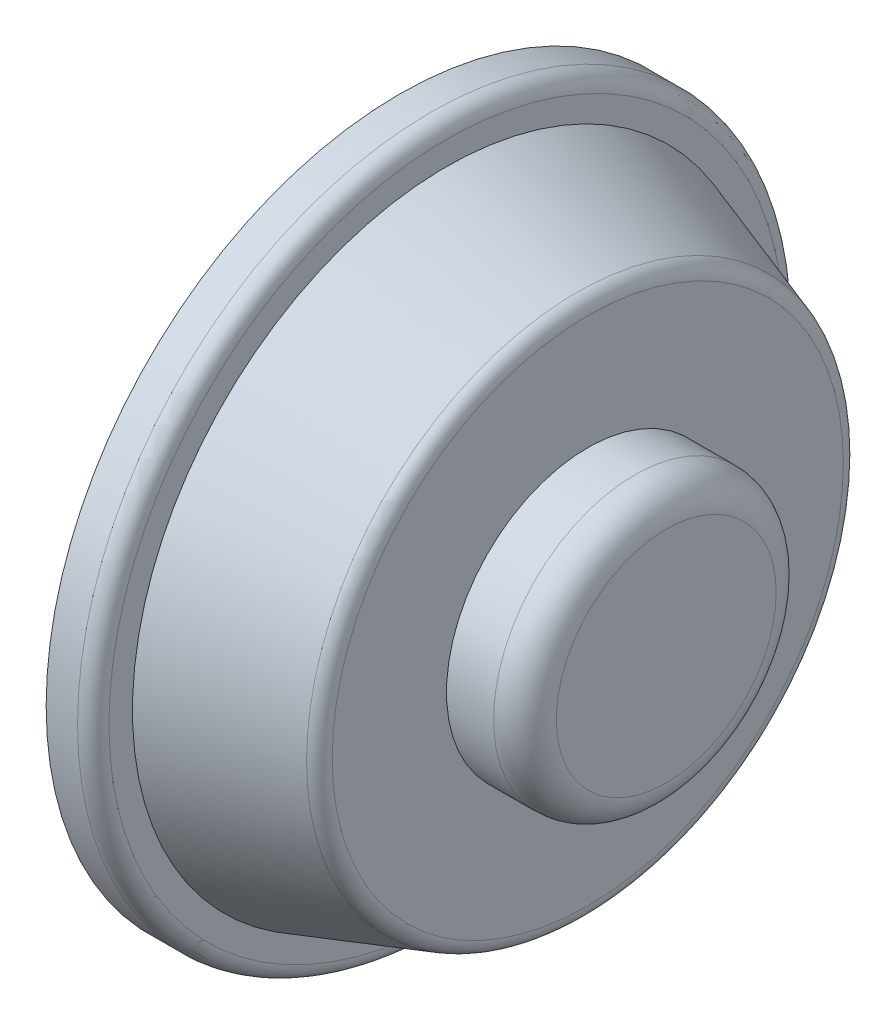
ISO-10303-21;
HEADER;
FILE_DESCRIPTION(('STEP AP214'),'2;1');
FILE_NAME('part.step','',(''),(''),'','','');
FILE_SCHEMA(('AUTOMOTIVE_DESIGN { 1 0 10303 214 1 1 1 1 }'));
ENDSEC;
DATA;
#1=APPLICATION_CONTEXT('core data for automotive mechanical design processes');
#2=APPLICATION_PROTOCOL_DEFINITION('international standard','automotive_design',2000,#1);
#3=PRODUCT_CONTEXT('',#1,'mechanical');
#4=PRODUCT('Part','Part','',(#3));
#5=PRODUCT_RELATED_PRODUCT_CATEGORY('part','',(#4));
#6=PRODUCT_DEFINITION_FORMATION('','',#4);
#7=PRODUCT_DEFINITION_CONTEXT('part definition',#1,'design');
#8=PRODUCT_DEFINITION('design','',#6,#7);
#9=PRODUCT_DEFINITION_SHAPE('','',#8);
#10=(LENGTH_UNIT() NAMED_UNIT(*) SI_UNIT(.MILLI.,.METRE.));
#11=(NAMED_UNIT(*) PLANE_ANGLE_UNIT() SI_UNIT($,.RADIAN.));
#12=(NAMED_UNIT(*) SI_UNIT($,.STERADIAN.) SOLID_ANGLE_UNIT());
#13=UNCERTAINTY_MEASURE_WITH_UNIT(LENGTH_MEASURE(1.E-05),#10,'distance_accuracy_value','');
#14=(GEOMETRIC_REPRESENTATION_CONTEXT(3) GLOBAL_UNCERTAINTY_ASSIGNED_CONTEXT((#13)) GLOBAL_UNIT_ASSIGNED_CONTEXT((#10,
#11,#12)) REPRESENTATION_CONTEXT('',''));
#15=CARTESIAN_POINT('',(0.,0.,0.));
#16=DIRECTION('',(0.,0.,1.));
#17=DIRECTION('',(1.,0.,0.));
#18=AXIS2_PLACEMENT_3D('',#15,#16,#17);
#19=CARTESIAN_POINT('',(3.,0.,0.));
#20=DIRECTION('',(1.,0.,0.));
#21=DIRECTION('',(0.,0.,-1.));
#22=AXIS2_PLACEMENT_3D('',#19,#20,#21);
#23=PLANE('',#22);
#24=CARTESIAN_POINT('',(3.,0.,0.));
#25=DIRECTION('',(1.,0.,0.));
#26=DIRECTION('',(0.,0.,-1.));
#27=AXIS2_PLACEMENT_3D('',#24,#25,#26);
#28=CIRCLE('',#27,21.5);
#29=CARTESIAN_POINT('',(3.,0.,-21.5));
#30=VERTEX_POINT('',#29);
#31=EDGE_CURVE('E70',#30,#30,#28,.T.);
#32=ORIENTED_EDGE('',*,*,#31,.T.);
#33=EDGE_LOOP('',(#32));
#34=FACE_BOUND('',#33,.T.);
#35=CARTESIAN_POINT('',(3.,0.,0.));
#36=DIRECTION('',(1.,0.,0.));
#37=DIRECTION('',(0.,0.,-1.));
#38=AXIS2_PLACEMENT_3D('',#35,#36,#37);
#39=CIRCLE('',#38,20.);
#40=CARTESIAN_POINT('',(3.,0.,-20.));
#41=VERTEX_POINT('',#40);
#42=EDGE_CURVE('E83',#41,#41,#39,.T.);
#43=ORIENTED_EDGE('',*,*,#42,.F.);
#44=EDGE_LOOP('',(#43));
#45=FACE_BOUND('',#44,.T.);
#46=ADVANCED_FACE('F47',(#34,#45),#23,.T.);
#47=CARTESIAN_POINT('',(3.,0.,0.));
#48=DIRECTION('',(-1.,0.,0.));
#49=DIRECTION('',(0.,0.,1.));
#50=AXIS2_PLACEMENT_3D('',#47,#48,#49);
#51=CYLINDRICAL_SURFACE('',#50,22.5);
#52=CARTESIAN_POINT('',(2.,0.,0.));
#53=DIRECTION('',(1.,0.,0.));
#54=DIRECTION('',(0.,0.,-1.));
#55=AXIS2_PLACEMENT_3D('',#52,#53,#54);
#56=CIRCLE('',#55,22.5);
#57=CARTESIAN_POINT('',(2.,0.,-22.5));
#58=VERTEX_POINT('',#57);
#59=EDGE_CURVE('E67',#58,#58,#56,.F.);
#60=ORIENTED_EDGE('',*,*,#59,.T.);
#61=EDGE_LOOP('',(#60));
#62=FACE_BOUND('',#61,.T.);
#63=CARTESIAN_POINT('',(0.,0.,0.));
#64=DIRECTION('',(1.,0.,0.));
#65=DIRECTION('',(0.,0.,-1.));
#66=AXIS2_PLACEMENT_3D('',#63,#64,#65);
#67=CIRCLE('',#66,22.5);
#68=CARTESIAN_POINT('',(0.,0.,-22.5));
#69=VERTEX_POINT('',#68);
#70=EDGE_CURVE('E80',#69,#69,#67,.T.);
#71=ORIENTED_EDGE('',*,*,#70,.T.);
#72=EDGE_LOOP('',(#71));
#73=FACE_BOUND('',#72,.T.);
#74=ADVANCED_FACE('F108',(#62,#73),#51,.T.);
#75=CARTESIAN_POINT('',(0.,0.,0.));
#76=DIRECTION('',(1.,0.,0.));
#77=DIRECTION('',(0.,0.,-1.));
#78=AXIS2_PLACEMENT_3D('',#75,#76,#77);
#79=PLANE('',#78);
#80=CARTESIAN_POINT('',(0.,0.,0.));
#81=DIRECTION('',(-1.,0.,0.));
#82=DIRECTION('',(0.,0.,1.));
#83=AXIS2_PLACEMENT_3D('',#80,#81,#82);
#84=CIRCLE('',#83,21.);
#85=CARTESIAN_POINT('',(0.,0.,21.));
#86=VERTEX_POINT('',#85);
#87=EDGE_CURVE('E86',#86,#86,#84,.T.);
#88=ORIENTED_EDGE('',*,*,#87,.F.);
#89=EDGE_LOOP('',(#88));
#90=FACE_BOUND('',#89,.T.);
#91=ORIENTED_EDGE('',*,*,#70,.F.);
#92=EDGE_LOOP('',(#91));
#93=FACE_BOUND('',#92,.T.);
#94=ADVANCED_FACE('F104',(#90,#93),#79,.F.);
#95=CARTESIAN_POINT('',(12.,0.,0.));
#96=DIRECTION('',(1.,0.,0.));
#97=DIRECTION('',(0.,0.,-1.));
#98=AXIS2_PLACEMENT_3D('',#95,#96,#97);
#99=PLANE('',#98);
#100=CARTESIAN_POINT('',(12.,0.,0.));
#101=DIRECTION('',(1.,0.,0.));
#102=DIRECTION('',(0.,0.,-1.));
#103=AXIS2_PLACEMENT_3D('',#100,#101,#102);
#104=CIRCLE('',#103,16.2792407799439);
#105=CARTESIAN_POINT('',(12.,0.,-16.2792407799439));
#106=VERTEX_POINT('',#105);
#107=EDGE_CURVE('E62',#106,#106,#104,.T.);
#108=ORIENTED_EDGE('',*,*,#107,.T.);
#109=EDGE_LOOP('',(#108));
#110=FACE_BOUND('',#109,.T.);
#111=CARTESIAN_POINT('',(12.,0.,0.));
#112=DIRECTION('',(1.,0.,0.));
#113=DIRECTION('',(0.,0.,-1.));
#114=AXIS2_PLACEMENT_3D('',#111,#112,#113);
#115=CIRCLE('',#114,9.);
#116=CARTESIAN_POINT('',(12.,0.,-9.));
#117=VERTEX_POINT('',#116);
#118=EDGE_CURVE('E79',#117,#117,#115,.T.);
#119=ORIENTED_EDGE('',*,*,#118,.F.);
#120=EDGE_LOOP('',(#119));
#121=FACE_BOUND('',#120,.T.);
#122=ADVANCED_FACE('F107',(#110,#121),#99,.T.);
#123=CARTESIAN_POINT('',(12.,0.,0.));
#124=DIRECTION('',(-1.,0.,0.));
#125=DIRECTION('',(0.,0.,1.));
#126=AXIS2_PLACEMENT_3D('',#123,#124,#125);
#127=CONICAL_SURFACE('',#126,17.,0.321750554396642);
#128=CARTESIAN_POINT('',(11.3162277660168,0.,0.));
#129=DIRECTION('',(1.,0.,0.));
#130=DIRECTION('',(0.,0.,-1.));
#131=AXIS2_PLACEMENT_3D('',#128,#129,#130);
#132=CIRCLE('',#131,17.2279240779944);
#133=CARTESIAN_POINT('',(11.3162277660168,0.,-17.2279240779944));
#134=VERTEX_POINT('',#133);
#135=EDGE_CURVE('E58',#134,#134,#132,.F.);
#136=ORIENTED_EDGE('',*,*,#135,.T.);
#137=EDGE_LOOP('',(#136));
#138=FACE_BOUND('',#137,.T.);
#139=ORIENTED_EDGE('',*,*,#42,.T.);
#140=EDGE_LOOP('',(#139));
#141=FACE_BOUND('',#140,.T.);
#142=ADVANCED_FACE('F139',(#138,#141),#127,.T.);
#143=CARTESIAN_POINT('',(17.,0.,0.));
#144=DIRECTION('',(-1.,0.,0.));
#145=DIRECTION('',(0.,0.,1.));
#146=AXIS2_PLACEMENT_3D('',#143,#144,#145);
#147=CYLINDRICAL_SURFACE('',#146,9.);
#148=CARTESIAN_POINT('',(15.,0.,0.));
#149=DIRECTION('',(1.,0.,0.));
#150=DIRECTION('',(0.,0.,-1.));
#151=AXIS2_PLACEMENT_3D('',#148,#149,#150);
#152=CIRCLE('',#151,9.);
#153=CARTESIAN_POINT('',(15.,0.,-9.));
#154=VERTEX_POINT('',#153);
#155=EDGE_CURVE('E73',#154,#154,#152,.F.);
#156=ORIENTED_EDGE('',*,*,#155,.T.);
#157=EDGE_LOOP('',(#156));
#158=FACE_BOUND('',#157,.T.);
#159=ORIENTED_EDGE('',*,*,#118,.T.);
#160=EDGE_LOOP('',(#159));
#161=FACE_BOUND('',#160,.T.);
#162=ADVANCED_FACE('F143',(#158,#161),#147,.T.);
#163=CARTESIAN_POINT('',(17.,0.,0.));
#164=DIRECTION('',(1.,0.,0.));
#165=DIRECTION('',(0.,0.,-1.));
#166=AXIS2_PLACEMENT_3D('',#163,#164,#165);
#167=PLANE('',#166);
#168=CARTESIAN_POINT('',(17.,0.,0.));
#169=DIRECTION('',(1.,0.,0.));
#170=DIRECTION('',(0.,0.,-1.));
#171=AXIS2_PLACEMENT_3D('',#168,#169,#170);
#172=CIRCLE('',#171,7.);
#173=CARTESIAN_POINT('',(17.,0.,-7.));
#174=VERTEX_POINT('',#173);
#175=EDGE_CURVE('E76',#174,#174,#172,.T.);
#176=ORIENTED_EDGE('',*,*,#175,.T.);
#177=EDGE_LOOP('',(#176));
#178=FACE_BOUND('',#177,.T.);
#179=ADVANCED_FACE('F126',(#178),#167,.T.);
#180=CARTESIAN_POINT('',(15.,0.,0.));
#181=DIRECTION('',(1.,0.,0.));
#182=DIRECTION('',(0.,0.,-1.));
#183=AXIS2_PLACEMENT_3D('',#180,#181,#182);
#184=TOROIDAL_SURFACE('',#183,7.,2.);
#185=ORIENTED_EDGE('',*,*,#155,.F.);
#186=EDGE_LOOP('',(#185));
#187=FACE_BOUND('',#186,.T.);
#188=ORIENTED_EDGE('',*,*,#175,.F.);
#189=EDGE_LOOP('',(#188));
#190=FACE_BOUND('',#189,.T.);
#191=ADVANCED_FACE('F122',(#187,#190),#184,.T.);
#192=CARTESIAN_POINT('',(2.,0.,0.));
#193=DIRECTION('',(1.,0.,0.));
#194=DIRECTION('',(0.,0.,-1.));
#195=AXIS2_PLACEMENT_3D('',#192,#193,#194);
#196=TOROIDAL_SURFACE('',#195,21.5,1.);
#197=ORIENTED_EDGE('',*,*,#59,.F.);
#198=EDGE_LOOP('',(#197));
#199=FACE_BOUND('',#198,.T.);
#200=ORIENTED_EDGE('',*,*,#31,.F.);
#201=EDGE_LOOP('',(#200));
#202=FACE_BOUND('',#201,.T.);
#203=ADVANCED_FACE('F125',(#199,#202),#196,.T.);
#204=CARTESIAN_POINT('',(11.,0.,0.));
#205=DIRECTION('',(1.,0.,0.));
#206=DIRECTION('',(0.,0.,-1.));
#207=AXIS2_PLACEMENT_3D('',#204,#205,#206);
#208=TOROIDAL_SURFACE('',#207,16.2792407799439,1.);
#209=ORIENTED_EDGE('',*,*,#135,.F.);
#210=EDGE_LOOP('',(#209));
#211=FACE_BOUND('',#210,.T.);
#212=ORIENTED_EDGE('',*,*,#107,.F.);
#213=EDGE_LOOP('',(#212));
#214=FACE_BOUND('',#213,.T.);
#215=ADVANCED_FACE('F100',(#211,#214),#208,.T.);
#216=CARTESIAN_POINT('',(2.,0.,0.));
#217=DIRECTION('',(-1.,0.,0.));
#218=DIRECTION('',(0.,0.,1.));
#219=AXIS2_PLACEMENT_3D('',#216,#217,#218);
#220=CYLINDRICAL_SURFACE('',#219,21.);
#221=CARTESIAN_POINT('',(1.,0.,0.));
#222=DIRECTION('',(-1.,0.,0.));
#223=DIRECTION('',(0.,0.,1.));
#224=AXIS2_PLACEMENT_3D('',#221,#222,#223);
#225=CIRCLE('',#224,21.);
#226=CARTESIAN_POINT('',(1.,0.,21.));
#227=VERTEX_POINT('',#226);
#228=EDGE_CURVE('E91',#227,#227,#225,.T.);
#229=ORIENTED_EDGE('',*,*,#228,.F.);
#230=EDGE_LOOP('',(#229));
#231=FACE_BOUND('',#230,.T.);
#232=ORIENTED_EDGE('',*,*,#87,.T.);
#233=EDGE_LOOP('',(#232));
#234=FACE_BOUND('',#233,.T.);
#235=ADVANCED_FACE('F97',(#231,#234),#220,.F.);
#236=CARTESIAN_POINT('',(1.,0.,0.));
#237=DIRECTION('',(-1.,0.,0.));
#238=DIRECTION('',(0.,0.,1.));
#239=AXIS2_PLACEMENT_3D('',#236,#237,#238);
#240=PLANE('',#239);
#241=CARTESIAN_POINT('',(1.,0.,0.));
#242=DIRECTION('',(-1.,0.,0.));
#243=DIRECTION('',(0.,0.,1.));
#244=AXIS2_PLACEMENT_3D('',#241,#242,#243);
#245=CIRCLE('',#244,19.3166247903554);
#246=CARTESIAN_POINT('',(1.,0.,19.3166247903554));
#247=VERTEX_POINT('',#246);
#248=EDGE_CURVE('E11',#247,#247,#245,.F.);
#249=ORIENTED_EDGE('',*,*,#248,.T.);
#250=EDGE_LOOP('',(#249));
#251=FACE_BOUND('',#250,.T.);
#252=ORIENTED_EDGE('',*,*,#228,.T.);
#253=EDGE_LOOP('',(#252));
#254=FACE_BOUND('',#253,.T.);
#255=ADVANCED_FACE('F95',(#251,#254),#240,.T.);
#256=CARTESIAN_POINT('',(2.,0.,0.));
#257=DIRECTION('',(-1.,0.,0.));
#258=DIRECTION('',(0.,0.,1.));
#259=AXIS2_PLACEMENT_3D('',#256,#257,#258);
#260=PLANE('',#259);
#261=CARTESIAN_POINT('',(2.,0.,0.));
#262=DIRECTION('',(-1.,0.,0.));
#263=DIRECTION('',(0.,0.,1.));
#264=AXIS2_PLACEMENT_3D('',#261,#262,#263);
#265=CIRCLE('',#264,16.);
#266=CARTESIAN_POINT('',(2.,0.,16.));
#267=VERTEX_POINT('',#266);
#268=EDGE_CURVE('E54',#267,#267,#265,.F.);
#269=ORIENTED_EDGE('',*,*,#268,.F.);
#270=EDGE_LOOP('',(#269));
#271=FACE_BOUND('',#270,.T.);
#272=ADVANCED_FACE('F156',(#271),#260,.T.);
#273=CARTESIAN_POINT('',(7.,0.,0.));
#274=DIRECTION('',(-1.,0.,0.));
#275=DIRECTION('',(0.,0.,1.));
#276=AXIS2_PLACEMENT_3D('',#273,#274,#275);
#277=TOROIDAL_SURFACE('',#276,19.3166247903554,6.);
#278=ORIENTED_EDGE('',*,*,#248,.F.);
#279=EDGE_LOOP('',(#278));
#280=FACE_BOUND('',#279,.T.);
#281=ORIENTED_EDGE('',*,*,#268,.T.);
#282=EDGE_LOOP('',(#281));
#283=FACE_BOUND('',#282,.T.);
#284=ADVANCED_FACE('F49',(#280,#283),#277,.T.);
#285=CLOSED_SHELL('',(#46,#74,#94,#122,#142,#162,#179,#191,#203,#215,#235,#255,#272,#284));
#286=MANIFOLD_SOLID_BREP('B2',#285);
#287=ADVANCED_BREP_SHAPE_REPRESENTATION('',(#18,#286),#14);
#288=SHAPE_DEFINITION_REPRESENTATION(#9,#287);
ENDSEC;
END-ISO-10303-21;
